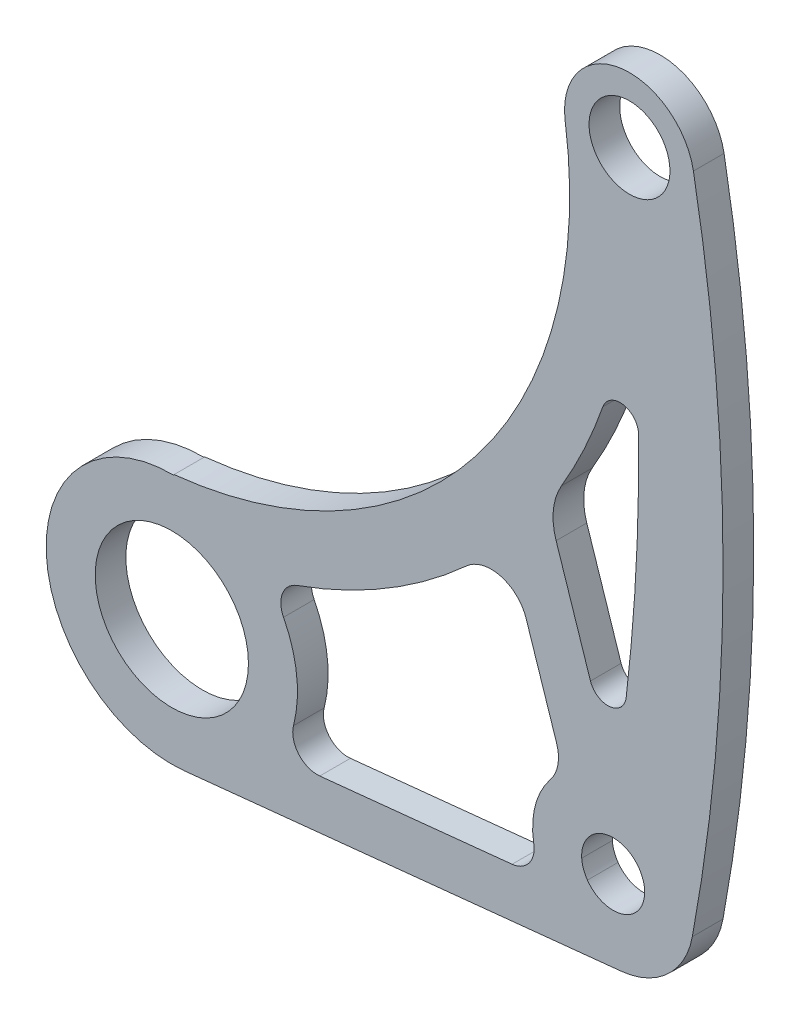
ISO-10303-21;
HEADER;
FILE_DESCRIPTION(('STEP AP214'),'2;1');
FILE_NAME('part.step','',(''),(''),'','','');
FILE_SCHEMA(('AUTOMOTIVE_DESIGN { 1 0 10303 214 1 1 1 1 }'));
ENDSEC;
DATA;
#1=APPLICATION_CONTEXT('core data for automotive mechanical design processes');
#2=APPLICATION_PROTOCOL_DEFINITION('international standard','automotive_design',2000,#1);
#3=PRODUCT_CONTEXT('',#1,'mechanical');
#4=PRODUCT('Part','Part','',(#3));
#5=PRODUCT_RELATED_PRODUCT_CATEGORY('part','',(#4));
#6=PRODUCT_DEFINITION_FORMATION('','',#4);
#7=PRODUCT_DEFINITION_CONTEXT('part definition',#1,'design');
#8=PRODUCT_DEFINITION('design','',#6,#7);
#9=PRODUCT_DEFINITION_SHAPE('','',#8);
#10=(LENGTH_UNIT() NAMED_UNIT(*) SI_UNIT(.MILLI.,.METRE.));
#11=(NAMED_UNIT(*) PLANE_ANGLE_UNIT() SI_UNIT($,.RADIAN.));
#12=(NAMED_UNIT(*) SI_UNIT($,.STERADIAN.) SOLID_ANGLE_UNIT());
#13=UNCERTAINTY_MEASURE_WITH_UNIT(LENGTH_MEASURE(1.E-05),#10,'distance_accuracy_value','');
#14=(GEOMETRIC_REPRESENTATION_CONTEXT(3) GLOBAL_UNCERTAINTY_ASSIGNED_CONTEXT((#13)) GLOBAL_UNIT_ASSIGNED_CONTEXT((#10,
#11,#12)) REPRESENTATION_CONTEXT('',''));
#15=CARTESIAN_POINT('',(0.,0.,0.));
#16=DIRECTION('',(0.,0.,1.));
#17=DIRECTION('',(1.,0.,0.));
#18=AXIS2_PLACEMENT_3D('',#15,#16,#17);
#19=CARTESIAN_POINT('',(45.72,0.,3.175));
#20=DIRECTION('',(0.,0.,-1.));
#21=DIRECTION('',(-1.,0.,0.));
#22=AXIS2_PLACEMENT_3D('',#19,#20,#21);
#23=CYLINDRICAL_SURFACE('',#22,3.2639);
#24=CARTESIAN_POINT('',(45.72,0.,0.));
#25=DIRECTION('',(0.,0.,1.));
#26=DIRECTION('',(1.,0.,0.));
#27=AXIS2_PLACEMENT_3D('',#24,#25,#26);
#28=CIRCLE('',#27,3.2639);
#29=CARTESIAN_POINT('',(42.4625763798194,-0.205510507492002,0.));
#30=VERTEX_POINT('',#29);
#31=CARTESIAN_POINT('',(43.0519360241002,-1.88002069948861,0.));
#32=VERTEX_POINT('',#31);
#33=EDGE_CURVE('E489',#30,#32,#28,.T.);
#34=ORIENTED_EDGE('',*,*,#33,.F.);
#35=DIRECTION('',(0.,0.,1.));
#36=VECTOR('',#35,1.);
#37=CARTESIAN_POINT('',(42.4625763798194,-0.205510507492002,3.175));
#38=LINE('',#37,#36);
#39=CARTESIAN_POINT('',(42.4625763798194,-0.205510507492002,3.175));
#40=VERTEX_POINT('',#39);
#41=EDGE_CURVE('E276',#30,#40,#38,.T.);
#42=ORIENTED_EDGE('',*,*,#41,.T.);
#43=CARTESIAN_POINT('',(45.72,0.,3.175));
#44=DIRECTION('',(0.,0.,1.));
#45=DIRECTION('',(1.,0.,0.));
#46=AXIS2_PLACEMENT_3D('',#43,#44,#45);
#47=CIRCLE('',#46,3.2639);
#48=CARTESIAN_POINT('',(43.0519360241002,-1.88002069948861,3.175));
#49=VERTEX_POINT('',#48);
#50=EDGE_CURVE('E522',#40,#49,#47,.T.);
#51=ORIENTED_EDGE('',*,*,#50,.T.);
#52=DIRECTION('',(0.,0.,1.));
#53=VECTOR('',#52,1.);
#54=CARTESIAN_POINT('',(43.0519360241002,-1.88002069948861,3.175));
#55=LINE('',#54,#53);
#56=EDGE_CURVE('E259',#32,#49,#55,.T.);
#57=ORIENTED_EDGE('',*,*,#56,.F.);
#58=EDGE_LOOP('',(#34,#42,#51,#57));
#59=FACE_BOUND('',#58,.T.);
#60=ADVANCED_FACE('F53',(#59),#23,.F.);
#61=CARTESIAN_POINT('',(48.9774236201806,0.205510507492002,3.175));
#62=VERTEX_POINT('',#61);
#63=EDGE_CURVE('E514',#49,#62,#47,.T.);
#64=ORIENTED_EDGE('',*,*,#63,.T.);
#65=DIRECTION('',(0.,0.,-1.));
#66=VECTOR('',#65,1.);
#67=CARTESIAN_POINT('',(48.9774236201806,0.205510507492002,3.175));
#68=LINE('',#67,#66);
#69=CARTESIAN_POINT('',(48.9774236201806,0.205510507492002,0.));
#70=VERTEX_POINT('',#69);
#71=EDGE_CURVE('E273',#62,#70,#68,.T.);
#72=ORIENTED_EDGE('',*,*,#71,.T.);
#73=EDGE_CURVE('E490',#32,#70,#28,.T.);
#74=ORIENTED_EDGE('',*,*,#73,.F.);
#75=ORIENTED_EDGE('',*,*,#56,.T.);
#76=EDGE_LOOP('',(#64,#72,#74,#75));
#77=FACE_BOUND('',#76,.T.);
#78=ADVANCED_FACE('F599',(#77),#23,.F.);
#79=ORIENTED_EDGE('',*,*,#71,.F.);
#80=CARTESIAN_POINT('',(48.3880639758998,1.88002069948861,3.175));
#81=VERTEX_POINT('',#80);
#82=EDGE_CURVE('E520',#62,#81,#47,.T.);
#83=ORIENTED_EDGE('',*,*,#82,.T.);
#84=DIRECTION('',(0.,0.,-1.));
#85=VECTOR('',#84,1.);
#86=CARTESIAN_POINT('',(48.3880639758998,1.88002069948861,3.175));
#87=LINE('',#86,#85);
#88=CARTESIAN_POINT('',(48.3880639758998,1.88002069948861,0.));
#89=VERTEX_POINT('',#88);
#90=EDGE_CURVE('E264',#81,#89,#87,.T.);
#91=ORIENTED_EDGE('',*,*,#90,.T.);
#92=EDGE_CURVE('E493',#70,#89,#28,.T.);
#93=ORIENTED_EDGE('',*,*,#92,.F.);
#94=EDGE_LOOP('',(#79,#83,#91,#93));
#95=FACE_BOUND('',#94,.T.);
#96=ADVANCED_FACE('F589',(#95),#23,.F.);
#97=CARTESIAN_POINT('',(-142.138533342949,38.656045003802,3.175));
#98=DIRECTION('',(0.,0.,-1.));
#99=DIRECTION('',(-1.,0.,0.));
#100=AXIS2_PLACEMENT_3D('',#97,#98,#99);
#101=CYLINDRICAL_SURFACE('',#100,190.5);
#102=CARTESIAN_POINT('',(-142.138533342949,38.656045003802,0.));
#103=DIRECTION('',(0.,0.,1.));
#104=DIRECTION('',(1.,0.,0.));
#105=AXIS2_PLACEMENT_3D('',#102,#103,#104);
#106=CIRCLE('',#105,190.5);
#107=CARTESIAN_POINT('',(47.0702030784157,16.5132343910918,0.));
#108=VERTEX_POINT('',#107);
#109=CARTESIAN_POINT('',(48.3497321227549,40.7704526909221,0.));
#110=VERTEX_POINT('',#109);
#111=EDGE_CURVE('E413',#108,#110,#106,.T.);
#112=ORIENTED_EDGE('',*,*,#111,.F.);
#113=DIRECTION('',(0.,0.,-1.));
#114=VECTOR('',#113,1.);
#115=CARTESIAN_POINT('',(47.0702030784158,16.5132343910918,3.175));
#116=LINE('',#115,#114);
#117=CARTESIAN_POINT('',(47.0702030784157,16.5132343910918,3.175));
#118=VERTEX_POINT('',#117);
#119=EDGE_CURVE('E354',#108,#118,#116,.F.);
#120=ORIENTED_EDGE('',*,*,#119,.T.);
#121=CARTESIAN_POINT('',(-142.138533342949,38.656045003802,3.175));
#122=DIRECTION('',(0.,0.,1.));
#123=DIRECTION('',(1.,0.,0.));
#124=AXIS2_PLACEMENT_3D('',#121,#122,#123);
#125=CIRCLE('',#124,190.5);
#126=CARTESIAN_POINT('',(48.3497321227549,40.7704526909221,3.175));
#127=VERTEX_POINT('',#126);
#128=EDGE_CURVE('E511',#118,#127,#125,.T.);
#129=ORIENTED_EDGE('',*,*,#128,.T.);
#130=DIRECTION('',(0.,0.,-1.));
#131=VECTOR('',#130,1.);
#132=CARTESIAN_POINT('',(48.3497321227549,40.7704526909221,3.175));
#133=LINE('',#132,#131);
#134=EDGE_CURVE('E350',#127,#110,#133,.T.);
#135=ORIENTED_EDGE('',*,*,#134,.T.);
#136=EDGE_LOOP('',(#112,#120,#129,#135));
#137=FACE_BOUND('',#136,.T.);
#138=ADVANCED_FACE('F500',(#137),#101,.F.);
#139=CARTESIAN_POINT('',(43.9242602583384,14.4500573911322,3.175));
#140=DIRECTION('',(0.949917524329056,0.312500715155273,0.));
#141=DIRECTION('',(-0.312500715155273,0.949917524329056,0.));
#142=AXIS2_PLACEMENT_3D('',#139,#140,#141);
#143=PLANE('',#142);
#144=DIRECTION('',(0.312500715155273,-0.949917524329056,0.));
#145=VECTOR('',#144,1.);
#146=CARTESIAN_POINT('',(43.9242602583384,14.4500573911322,0.));
#147=LINE('',#146,#145);
#148=CARTESIAN_POINT('',(39.8116959434713,26.9511389028385,0.));
#149=VERTEX_POINT('',#148);
#150=CARTESIAN_POINT('',(43.3685228303553,16.1393486348481,0.));
#151=VERTEX_POINT('',#150);
#152=EDGE_CURVE('E407',#149,#151,#147,.T.);
#153=ORIENTED_EDGE('',*,*,#152,.F.);
#154=DIRECTION('',(0.,0.,-1.));
#155=VECTOR('',#154,1.);
#156=CARTESIAN_POINT('',(39.8116959434713,26.9511389028385,3.175));
#157=LINE('',#156,#155);
#158=CARTESIAN_POINT('',(39.8116959434713,26.9511389028385,3.175));
#159=VERTEX_POINT('',#158);
#160=EDGE_CURVE('E75',#149,#159,#157,.F.);
#161=ORIENTED_EDGE('',*,*,#160,.T.);
#162=DIRECTION('',(0.312500715155273,-0.949917524329056,0.));
#163=VECTOR('',#162,1.);
#164=CARTESIAN_POINT('',(43.9242602583384,14.4500573911322,3.175));
#165=LINE('',#164,#163);
#166=CARTESIAN_POINT('',(43.3685228303553,16.1393486348481,3.175));
#167=VERTEX_POINT('',#166);
#168=EDGE_CURVE('E510',#159,#167,#165,.T.);
#169=ORIENTED_EDGE('',*,*,#168,.T.);
#170=DIRECTION('',(0.,0.,1.));
#171=VECTOR('',#170,1.);
#172=CARTESIAN_POINT('',(43.3685228303553,16.1393486348481,0.));
#173=LINE('',#172,#171);
#174=EDGE_CURVE('E346',#167,#151,#173,.F.);
#175=ORIENTED_EDGE('',*,*,#174,.T.);
#176=EDGE_LOOP('',(#153,#161,#169,#175));
#177=FACE_BOUND('',#176,.T.);
#178=ADVANCED_FACE('F637',(#177),#143,.T.);
#179=CARTESIAN_POINT('',(0.811388888888889,-7.89592010604133,3.175));
#180=DIRECTION('',(-0.102222222222222,0.994761588162687,0.));
#181=DIRECTION('',(-0.994761588162687,-0.102222222222222,0.));
#182=AXIS2_PLACEMENT_3D('',#179,#180,#181);
#183=PLANE('',#182);
#184=DIRECTION('',(0.994761588162687,0.102222222222222,0.));
#185=VECTOR('',#184,1.);
#186=CARTESIAN_POINT('',(0.811388888888889,-7.89592010604133,0.));
#187=LINE('',#186,#185);
#188=CARTESIAN_POINT('',(15.3261433532772,-6.40437632910465,0.));
#189=VERTEX_POINT('',#188);
#190=CARTESIAN_POINT('',(35.2507315842154,-4.35691519865322,0.));
#191=VERTEX_POINT('',#190);
#192=EDGE_CURVE('E470',#189,#191,#187,.T.);
#193=ORIENTED_EDGE('',*,*,#192,.F.);
#194=DIRECTION('',(0.,0.,-1.));
#195=VECTOR('',#194,1.);
#196=CARTESIAN_POINT('',(15.3261433532772,-6.40437632910465,3.175));
#197=LINE('',#196,#195);
#198=CARTESIAN_POINT('',(15.3261433532772,-6.40437632910465,3.175));
#199=VERTEX_POINT('',#198);
#200=EDGE_CURVE('E290',#189,#199,#197,.F.);
#201=ORIENTED_EDGE('',*,*,#200,.T.);
#202=DIRECTION('',(0.994761588162687,0.102222222222222,0.));
#203=VECTOR('',#202,1.);
#204=CARTESIAN_POINT('',(0.811388888888889,-7.89592010604133,3.175));
#205=LINE('',#204,#203);
#206=CARTESIAN_POINT('',(35.2507315842154,-4.35691519865322,3.175));
#207=VERTEX_POINT('',#206);
#208=EDGE_CURVE('E561',#199,#207,#205,.T.);
#209=ORIENTED_EDGE('',*,*,#208,.T.);
#210=DIRECTION('',(0.,0.,-1.));
#211=VECTOR('',#210,1.);
#212=CARTESIAN_POINT('',(35.2507315842154,-4.35691519865322,3.175));
#213=LINE('',#212,#211);
#214=EDGE_CURVE('E286',#207,#191,#213,.T.);
#215=ORIENTED_EDGE('',*,*,#214,.T.);
#216=EDGE_LOOP('',(#193,#201,#209,#215));
#217=FACE_BOUND('',#216,.T.);
#218=ADVANCED_FACE('F643',(#217),#183,.T.);
#219=CARTESIAN_POINT('',(0.,0.,3.175));
#220=DIRECTION('',(0.,0.,-1.));
#221=DIRECTION('',(-1.,0.,0.));
#222=AXIS2_PLACEMENT_3D('',#219,#220,#221);
#223=CYLINDRICAL_SURFACE('',#222,13.0175);
#224=CARTESIAN_POINT('',(0.,0.,3.175));
#225=DIRECTION('',(0.,0.,1.));
#226=DIRECTION('',(1.,0.,0.));
#227=AXIS2_PLACEMENT_3D('',#224,#225,#226);
#228=CIRCLE('',#227,13.0175);
#229=CARTESIAN_POINT('',(12.6066623522887,-3.24459097351078,3.175));
#230=VERTEX_POINT('',#229);
#231=CARTESIAN_POINT('',(11.5722495603721,5.9614047306376,3.175));
#232=VERTEX_POINT('',#231);
#233=EDGE_CURVE('E565',#230,#232,#228,.T.);
#234=ORIENTED_EDGE('',*,*,#233,.F.);
#235=DIRECTION('',(0.,0.,-1.));
#236=VECTOR('',#235,1.);
#237=CARTESIAN_POINT('',(12.6066623522887,-3.24459097351078,3.175));
#238=LINE('',#237,#236);
#239=CARTESIAN_POINT('',(12.6066623522887,-3.24459097351078,0.));
#240=VERTEX_POINT('',#239);
#241=EDGE_CURVE('E282',#230,#240,#238,.T.);
#242=ORIENTED_EDGE('',*,*,#241,.T.);
#243=CARTESIAN_POINT('',(0.,0.,0.));
#244=DIRECTION('',(0.,0.,1.));
#245=DIRECTION('',(1.,0.,0.));
#246=AXIS2_PLACEMENT_3D('',#243,#244,#245);
#247=CIRCLE('',#246,13.0175);
#248=CARTESIAN_POINT('',(11.5722495603721,5.9614047306376,0.));
#249=VERTEX_POINT('',#248);
#250=EDGE_CURVE('E474',#240,#249,#247,.T.);
#251=ORIENTED_EDGE('',*,*,#250,.T.);
#252=DIRECTION('',(0.,0.,-1.));
#253=VECTOR('',#252,1.);
#254=CARTESIAN_POINT('',(11.5722495603721,5.9614047306376,3.175));
#255=LINE('',#254,#253);
#256=EDGE_CURVE('E279',#249,#232,#255,.F.);
#257=ORIENTED_EDGE('',*,*,#256,.T.);
#258=EDGE_LOOP('',(#234,#242,#251,#257));
#259=FACE_BOUND('',#258,.T.);
#260=ADVANCED_FACE('F758',(#259),#223,.T.);
#261=CARTESIAN_POINT('',(-4.50533240745612,58.5644592406378,3.175));
#262=DIRECTION('',(0.,0.,-1.));
#263=DIRECTION('',(-1.,0.,0.));
#264=AXIS2_PLACEMENT_3D('',#261,#262,#263);
#265=CYLINDRICAL_SURFACE('',#264,52.07);
#266=CARTESIAN_POINT('',(-4.50533240745612,58.5644592406378,0.));
#267=DIRECTION('',(0.,0.,1.));
#268=DIRECTION('',(1.,0.,0.));
#269=AXIS2_PLACEMENT_3D('',#266,#267,#268);
#270=CIRCLE('',#269,52.07);
#271=CARTESIAN_POINT('',(12.9774317126353,9.51715698331437,0.));
#272=VERTEX_POINT('',#271);
#273=CARTESIAN_POINT('',(30.5233562094004,20.0381581752188,0.));
#274=VERTEX_POINT('',#273);
#275=EDGE_CURVE('E478',#272,#274,#270,.T.);
#276=ORIENTED_EDGE('',*,*,#275,.T.);
#277=DIRECTION('',(0.,0.,-1.));
#278=VECTOR('',#277,1.);
#279=CARTESIAN_POINT('',(30.5233562094004,20.0381581752188,3.175));
#280=LINE('',#279,#278);
#281=CARTESIAN_POINT('',(30.5233562094004,20.0381581752188,3.175));
#282=VERTEX_POINT('',#281);
#283=EDGE_CURVE('E331',#274,#282,#280,.F.);
#284=ORIENTED_EDGE('',*,*,#283,.T.);
#285=CARTESIAN_POINT('',(-4.50533240745612,58.5644592406378,3.175));
#286=DIRECTION('',(0.,0.,1.));
#287=DIRECTION('',(1.,0.,0.));
#288=AXIS2_PLACEMENT_3D('',#285,#286,#287);
#289=CIRCLE('',#288,52.07);
#290=CARTESIAN_POINT('',(12.9774317126353,9.51715698331437,3.175));
#291=VERTEX_POINT('',#290);
#292=EDGE_CURVE('E569',#291,#282,#289,.T.);
#293=ORIENTED_EDGE('',*,*,#292,.F.);
#294=DIRECTION('',(0.,0.,-1.));
#295=VECTOR('',#294,1.);
#296=CARTESIAN_POINT('',(12.9774317126353,9.51715698331437,3.175));
#297=LINE('',#296,#295);
#298=EDGE_CURVE('E297',#291,#272,#297,.T.);
#299=ORIENTED_EDGE('',*,*,#298,.T.);
#300=EDGE_LOOP('',(#276,#284,#293,#299));
#301=FACE_BOUND('',#300,.T.);
#302=ADVANCED_FACE('F766',(#301),#265,.T.);
#303=CARTESIAN_POINT('',(38.586011370491,12.6938979852854,3.175));
#304=DIRECTION('',(0.949917524329056,0.312500715155272,0.));
#305=DIRECTION('',(-0.312500715155272,0.949917524329057,0.));
#306=AXIS2_PLACEMENT_3D('',#303,#304,#305);
#307=PLANE('',#306);
#308=DIRECTION('',(0.312500715155272,-0.949917524329057,0.));
#309=VECTOR('',#308,1.);
#310=CARTESIAN_POINT('',(38.586011370491,12.6938979852854,0.));
#311=LINE('',#310,#309);
#312=CARTESIAN_POINT('',(36.7056167539373,18.4097882610273,0.));
#313=VERTEX_POINT('',#312);
#314=CARTESIAN_POINT('',(39.8655919363517,8.80431967600672,0.));
#315=VERTEX_POINT('',#314);
#316=EDGE_CURVE('E482',#313,#315,#311,.T.);
#317=ORIENTED_EDGE('',*,*,#316,.T.);
#318=DIRECTION('',(0.,0.,1.));
#319=VECTOR('',#318,1.);
#320=CARTESIAN_POINT('',(39.8655919363517,8.80431967600672,3.175));
#321=LINE('',#320,#319);
#322=CARTESIAN_POINT('',(39.8655919363517,8.80431967600672,3.175));
#323=VERTEX_POINT('',#322);
#324=EDGE_CURVE('E328',#315,#323,#321,.T.);
#325=ORIENTED_EDGE('',*,*,#324,.T.);
#326=DIRECTION('',(0.312500715155272,-0.949917524329057,0.));
#327=VECTOR('',#326,1.);
#328=CARTESIAN_POINT('',(38.586011370491,12.6938979852854,3.175));
#329=LINE('',#328,#327);
#330=CARTESIAN_POINT('',(36.7056167539373,18.4097882610273,3.175));
#331=VERTEX_POINT('',#330);
#332=EDGE_CURVE('E573',#331,#323,#329,.T.);
#333=ORIENTED_EDGE('',*,*,#332,.F.);
#334=DIRECTION('',(0.,0.,1.));
#335=VECTOR('',#334,1.);
#336=CARTESIAN_POINT('',(36.7056167539373,18.4097882610273,0.));
#337=LINE('',#336,#335);
#338=EDGE_CURVE('E324',#331,#313,#337,.F.);
#339=ORIENTED_EDGE('',*,*,#338,.T.);
#340=EDGE_LOOP('',(#317,#325,#333,#339));
#341=FACE_BOUND('',#340,.T.);
#342=ADVANCED_FACE('F675',(#341),#307,.F.);
#343=CARTESIAN_POINT('',(45.72,0.,3.175));
#344=DIRECTION('',(0.,0.,-1.));
#345=DIRECTION('',(-1.,0.,0.));
#346=AXIS2_PLACEMENT_3D('',#343,#344,#345);
#347=CYLINDRICAL_SURFACE('',#346,8.3439);
#348=CARTESIAN_POINT('',(45.72,0.,0.));
#349=DIRECTION('',(0.,0.,1.));
#350=DIRECTION('',(1.,0.,0.));
#351=AXIS2_PLACEMENT_3D('',#348,#349,#350);
#352=CIRCLE('',#351,8.3439);
#353=CARTESIAN_POINT('',(46.572932,-8.30019121547064,0.));
#354=VERTEX_POINT('',#353);
#355=CARTESIAN_POINT('',(53.9245222927567,-1.51871036002841,0.));
#356=VERTEX_POINT('',#355);
#357=EDGE_CURVE('E257',#354,#356,#352,.T.);
#358=ORIENTED_EDGE('',*,*,#357,.T.);
#359=DIRECTION('',(0.,0.,-1.));
#360=VECTOR('',#359,1.);
#361=CARTESIAN_POINT('',(53.9245222927567,-1.51871036002841,3.175));
#362=LINE('',#361,#360);
#363=CARTESIAN_POINT('',(53.9245222927567,-1.51871036002841,3.175));
#364=VERTEX_POINT('',#363);
#365=EDGE_CURVE('E235',#364,#356,#362,.T.);
#366=ORIENTED_EDGE('',*,*,#365,.F.);
#367=CARTESIAN_POINT('',(45.72,0.,3.175));
#368=DIRECTION('',(0.,0.,1.));
#369=DIRECTION('',(1.,0.,0.));
#370=AXIS2_PLACEMENT_3D('',#367,#368,#369);
#371=CIRCLE('',#370,8.3439);
#372=CARTESIAN_POINT('',(46.572932,-8.30019121547064,3.175));
#373=VERTEX_POINT('',#372);
#374=EDGE_CURVE('E243',#373,#364,#371,.T.);
#375=ORIENTED_EDGE('',*,*,#374,.F.);
#376=DIRECTION('',(0.,0.,-1.));
#377=VECTOR('',#376,1.);
#378=CARTESIAN_POINT('',(46.572932,-8.30019121547064,3.175));
#379=LINE('',#378,#377);
#380=EDGE_CURVE('E420',#373,#354,#379,.T.);
#381=ORIENTED_EDGE('',*,*,#380,.T.);
#382=EDGE_LOOP('',(#358,#366,#375,#381));
#383=FACE_BOUND('',#382,.T.);
#384=ADVANCED_FACE('F255',(#383),#347,.T.);
#385=CARTESIAN_POINT('',(-133.393338272466,33.1550421520357,3.175));
#386=DIRECTION('',(0.,0.,-1.));
#387=DIRECTION('',(-1.,0.,0.));
#388=AXIS2_PLACEMENT_3D('',#385,#386,#387);
#389=CYLINDRICAL_SURFACE('',#388,190.5);
#390=CARTESIAN_POINT('',(-133.393338272466,33.1550421520357,0.));
#391=DIRECTION('',(0.,0.,1.));
#392=DIRECTION('',(1.,0.,0.));
#393=AXIS2_PLACEMENT_3D('',#390,#391,#392);
#394=CIRCLE('',#393,190.5);
#395=CARTESIAN_POINT('',(54.0358306347205,67.2219857008992,0.));
#396=VERTEX_POINT('',#395);
#397=EDGE_CURVE('E450',#356,#396,#394,.T.);
#398=ORIENTED_EDGE('',*,*,#397,.T.);
#399=DIRECTION('',(0.,0.,-1.));
#400=VECTOR('',#399,1.);
#401=CARTESIAN_POINT('',(54.0358306347205,67.2219857008992,3.175));
#402=LINE('',#401,#400);
#403=CARTESIAN_POINT('',(54.0358306347205,67.2219857008992,3.175));
#404=VERTEX_POINT('',#403);
#405=EDGE_CURVE('E238',#404,#396,#402,.T.);
#406=ORIENTED_EDGE('',*,*,#405,.F.);
#407=CARTESIAN_POINT('',(-133.393338272466,33.1550421520357,3.175));
#408=DIRECTION('',(0.,0.,1.));
#409=DIRECTION('',(1.,0.,0.));
#410=AXIS2_PLACEMENT_3D('',#407,#408,#409);
#411=CIRCLE('',#410,190.5);
#412=EDGE_CURVE('E231',#364,#404,#411,.T.);
#413=ORIENTED_EDGE('',*,*,#412,.F.);
#414=ORIENTED_EDGE('',*,*,#365,.T.);
#415=EDGE_LOOP('',(#398,#406,#413,#414));
#416=FACE_BOUND('',#415,.T.);
#417=ADVANCED_FACE('F233',(#416),#389,.T.);
#418=CARTESIAN_POINT('',(47.4133333333333,66.0182870288394,3.175));
#419=DIRECTION('',(0.,0.,-1.));
#420=DIRECTION('',(-1.,0.,0.));
#421=AXIS2_PLACEMENT_3D('',#418,#419,#420);
#422=CYLINDRICAL_SURFACE('',#421,6.73099999999993);
#423=CARTESIAN_POINT('',(47.4133333333333,66.0182870288394,0.));
#424=DIRECTION('',(0.,0.,1.));
#425=DIRECTION('',(1.,0.,0.));
#426=AXIS2_PLACEMENT_3D('',#423,#424,#425);
#427=CIRCLE('',#426,6.73099999999993);
#428=CARTESIAN_POINT('',(40.7506474150239,65.0617425427021,0.));
#429=VERTEX_POINT('',#428);
#430=EDGE_CURVE('E446',#396,#429,#427,.T.);
#431=ORIENTED_EDGE('',*,*,#430,.T.);
#432=DIRECTION('',(0.,0.,-1.));
#433=VECTOR('',#432,1.);
#434=CARTESIAN_POINT('',(40.7506474150239,65.0617425427021,3.175));
#435=LINE('',#434,#433);
#436=CARTESIAN_POINT('',(40.7506474150239,65.0617425427021,3.175));
#437=VERTEX_POINT('',#436);
#438=EDGE_CURVE('E266',#437,#429,#435,.T.);
#439=ORIENTED_EDGE('',*,*,#438,.F.);
#440=CARTESIAN_POINT('',(47.4133333333333,66.0182870288394,3.175));
#441=DIRECTION('',(0.,0.,1.));
#442=DIRECTION('',(1.,0.,0.));
#443=AXIS2_PLACEMENT_3D('',#440,#441,#442);
#444=CIRCLE('',#443,6.73099999999993);
#445=EDGE_CURVE('E242',#404,#437,#444,.T.);
#446=ORIENTED_EDGE('',*,*,#445,.F.);
#447=ORIENTED_EDGE('',*,*,#405,.T.);
#448=EDGE_LOOP('',(#431,#439,#446,#447));
#449=FACE_BOUND('',#448,.T.);
#450=ADVANCED_FACE('F447',(#449),#422,.T.);
#451=CARTESIAN_POINT('',(-4.50533240745612,58.5644592406378,3.175));
#452=DIRECTION('',(0.,0.,-1.));
#453=DIRECTION('',(-1.,0.,0.));
#454=AXIS2_PLACEMENT_3D('',#451,#452,#453);
#455=CYLINDRICAL_SURFACE('',#454,45.72);
#456=CARTESIAN_POINT('',(-4.50533240745612,58.5644592406378,0.));
#457=DIRECTION('',(0.,0.,1.));
#458=DIRECTION('',(1.,0.,0.));
#459=AXIS2_PLACEMENT_3D('',#456,#457,#458);
#460=CIRCLE('',#459,45.72);
#461=CARTESIAN_POINT('',(0.230104831543752,13.0903563450831,0.));
#462=VERTEX_POINT('',#461);
#463=EDGE_CURVE('E440',#462,#429,#460,.T.);
#464=ORIENTED_EDGE('',*,*,#463,.F.);
#465=DIRECTION('',(0.,0.,-1.));
#466=VECTOR('',#465,1.);
#467=CARTESIAN_POINT('',(0.230104831543752,13.0903563450831,3.175));
#468=LINE('',#467,#466);
#469=CARTESIAN_POINT('',(0.230104831543752,13.0903563450831,3.175));
#470=VERTEX_POINT('',#469);
#471=EDGE_CURVE('E430',#470,#462,#468,.T.);
#472=ORIENTED_EDGE('',*,*,#471,.F.);
#473=CARTESIAN_POINT('',(-4.50533240745612,58.5644592406378,3.175));
#474=DIRECTION('',(0.,0.,1.));
#475=DIRECTION('',(1.,0.,0.));
#476=AXIS2_PLACEMENT_3D('',#473,#474,#475);
#477=CIRCLE('',#476,45.72);
#478=EDGE_CURVE('E443',#470,#437,#477,.T.);
#479=ORIENTED_EDGE('',*,*,#478,.T.);
#480=ORIENTED_EDGE('',*,*,#438,.T.);
#481=EDGE_LOOP('',(#464,#472,#479,#480));
#482=FACE_BOUND('',#481,.T.);
#483=ADVANCED_FACE('F438',(#482),#455,.F.);
#484=CARTESIAN_POINT('',(-6.2268221741051,4.92245790861365,3.175));
#485=DIRECTION('',(-0.784481533745524,0.620152177463137,0.));
#486=DIRECTION('',(-0.620152177463137,-0.784481533745524,0.));
#487=AXIS2_PLACEMENT_3D('',#484,#485,#486);
#488=PLANE('',#487);
#489=DIRECTION('',(0.620152177463137,0.784481533745524,0.));
#490=VECTOR('',#489,1.);
#491=CARTESIAN_POINT('',(-6.2268221741051,4.92245790861365,0.));
#492=LINE('',#491,#490);
#493=CARTESIAN_POINT('',(0.171615761059916,13.0163687056166,0.));
#494=VERTEX_POINT('',#493);
#495=EDGE_CURVE('E455',#494,#462,#492,.T.);
#496=ORIENTED_EDGE('',*,*,#495,.F.);
#497=DIRECTION('',(0.,0.,-1.));
#498=VECTOR('',#497,1.);
#499=CARTESIAN_POINT('',(0.171615761059916,13.0163687056166,3.175));
#500=LINE('',#499,#498);
#501=CARTESIAN_POINT('',(0.171615761059916,13.0163687056166,3.175));
#502=VERTEX_POINT('',#501);
#503=EDGE_CURVE('E427',#502,#494,#500,.T.);
#504=ORIENTED_EDGE('',*,*,#503,.F.);
#505=DIRECTION('',(0.620152177463137,0.784481533745524,0.));
#506=VECTOR('',#505,1.);
#507=CARTESIAN_POINT('',(-6.2268221741051,4.92245790861365,3.175));
#508=LINE('',#507,#506);
#509=EDGE_CURVE('E548',#502,#470,#508,.T.);
#510=ORIENTED_EDGE('',*,*,#509,.T.);
#511=ORIENTED_EDGE('',*,*,#471,.T.);
#512=EDGE_LOOP('',(#496,#504,#510,#511));
#513=FACE_BOUND('',#512,.T.);
#514=ADVANCED_FACE('F545',(#513),#488,.T.);
#515=CARTESIAN_POINT('',(0.,0.,3.175));
#516=DIRECTION('',(0.,0.,-1.));
#517=DIRECTION('',(-1.,0.,0.));
#518=AXIS2_PLACEMENT_3D('',#515,#516,#517);
#519=CYLINDRICAL_SURFACE('',#518,13.0175);
#520=CARTESIAN_POINT('',(0.,0.,0.));
#521=DIRECTION('',(0.,0.,1.));
#522=DIRECTION('',(1.,0.,0.));
#523=AXIS2_PLACEMENT_3D('',#520,#521,#522);
#524=CIRCLE('',#523,13.0175);
#525=CARTESIAN_POINT('',(1.33067777777778,-12.9493089739078,0.));
#526=VERTEX_POINT('',#525);
#527=EDGE_CURVE('E459',#494,#526,#524,.T.);
#528=ORIENTED_EDGE('',*,*,#527,.T.);
#529=DIRECTION('',(0.,0.,-1.));
#530=VECTOR('',#529,1.);
#531=CARTESIAN_POINT('',(1.33067777777778,-12.9493089739078,3.175));
#532=LINE('',#531,#530);
#533=CARTESIAN_POINT('',(1.33067777777778,-12.9493089739078,3.175));
#534=VERTEX_POINT('',#533);
#535=EDGE_CURVE('E423',#534,#526,#532,.T.);
#536=ORIENTED_EDGE('',*,*,#535,.F.);
#537=CARTESIAN_POINT('',(0.,0.,3.175));
#538=DIRECTION('',(0.,0.,1.));
#539=DIRECTION('',(1.,0.,0.));
#540=AXIS2_PLACEMENT_3D('',#537,#538,#539);
#541=CIRCLE('',#540,13.0175);
#542=EDGE_CURVE('E553',#502,#534,#541,.T.);
#543=ORIENTED_EDGE('',*,*,#542,.F.);
#544=ORIENTED_EDGE('',*,*,#503,.T.);
#545=EDGE_LOOP('',(#528,#536,#543,#544));
#546=FACE_BOUND('',#545,.T.);
#547=ADVANCED_FACE('F543',(#546),#519,.T.);
#548=CARTESIAN_POINT('',(47.4133333333333,66.0182870288394,3.175));
#549=DIRECTION('',(0.,0.,-1.));
#550=DIRECTION('',(-1.,0.,0.));
#551=AXIS2_PLACEMENT_3D('',#548,#549,#550);
#552=CYLINDRICAL_SURFACE('',#551,4.1910000000001);
#553=CARTESIAN_POINT('',(47.4133333333333,66.0182870288394,3.175));
#554=DIRECTION('',(0.,0.,1.));
#555=DIRECTION('',(1.,0.,0.));
#556=AXIS2_PLACEMENT_3D('',#553,#554,#555);
#557=CIRCLE('',#556,4.1910000000001);
#558=CARTESIAN_POINT('',(51.6043333333335,66.0182870288394,3.175));
#559=VERTEX_POINT('',#558);
#560=EDGE_CURVE('E528',#559,#559,#557,.T.);
#561=ORIENTED_EDGE('',*,*,#560,.T.);
#562=EDGE_LOOP('',(#561));
#563=FACE_BOUND('',#562,.T.);
#564=CARTESIAN_POINT('',(47.4133333333333,66.0182870288394,0.));
#565=DIRECTION('',(0.,0.,1.));
#566=DIRECTION('',(1.,0.,0.));
#567=AXIS2_PLACEMENT_3D('',#564,#565,#566);
#568=CIRCLE('',#567,4.1910000000001);
#569=CARTESIAN_POINT('',(51.6043333333335,66.0182870288394,0.));
#570=VERTEX_POINT('',#569);
#571=EDGE_CURVE('E406',#570,#570,#568,.T.);
#572=ORIENTED_EDGE('',*,*,#571,.F.);
#573=EDGE_LOOP('',(#572));
#574=FACE_BOUND('',#573,.T.);
#575=ADVANCED_FACE('F633',(#563,#574),#552,.F.);
#576=CARTESIAN_POINT('',(-4.50533240745612,58.5644592406378,3.175));
#577=DIRECTION('',(0.,0.,-1.));
#578=DIRECTION('',(-1.,0.,0.));
#579=AXIS2_PLACEMENT_3D('',#576,#577,#578);
#580=CYLINDRICAL_SURFACE('',#579,52.07);
#581=CARTESIAN_POINT('',(-4.50533240745612,58.5644592406378,3.175));
#582=DIRECTION('',(0.,0.,1.));
#583=DIRECTION('',(1.,0.,0.));
#584=AXIS2_PLACEMENT_3D('',#581,#582,#583);
#585=CIRCLE('',#584,52.07);
#586=CARTESIAN_POINT('',(40.3709543283503,32.1560554871792,3.175));
#587=VERTEX_POINT('',#586);
#588=CARTESIAN_POINT('',(44.646607754843,41.3780786361658,3.175));
#589=VERTEX_POINT('',#588);
#590=EDGE_CURVE('E398',#587,#589,#585,.T.);
#591=ORIENTED_EDGE('',*,*,#590,.F.);
#592=DIRECTION('',(0.,0.,-1.));
#593=VECTOR('',#592,1.);
#594=CARTESIAN_POINT('',(40.3709543283503,32.1560554871792,3.175));
#595=LINE('',#594,#593);
#596=CARTESIAN_POINT('',(40.3709543283503,32.1560554871792,0.));
#597=VERTEX_POINT('',#596);
#598=EDGE_CURVE('E375',#587,#597,#595,.T.);
#599=ORIENTED_EDGE('',*,*,#598,.T.);
#600=CARTESIAN_POINT('',(-4.50533240745612,58.5644592406378,0.));
#601=DIRECTION('',(0.,0.,1.));
#602=DIRECTION('',(1.,0.,0.));
#603=AXIS2_PLACEMENT_3D('',#600,#601,#602);
#604=CIRCLE('',#603,52.07);
#605=CARTESIAN_POINT('',(44.646607754843,41.3780786361658,0.));
#606=VERTEX_POINT('',#605);
#607=EDGE_CURVE('E397',#597,#606,#604,.T.);
#608=ORIENTED_EDGE('',*,*,#607,.T.);
#609=DIRECTION('',(0.,0.,-1.));
#610=VECTOR('',#609,1.);
#611=CARTESIAN_POINT('',(44.646607754843,41.3780786361658,3.175));
#612=LINE('',#611,#610);
#613=EDGE_CURVE('E357',#606,#589,#612,.F.);
#614=ORIENTED_EDGE('',*,*,#613,.T.);
#615=EDGE_LOOP('',(#591,#599,#608,#614));
#616=FACE_BOUND('',#615,.T.);
#617=ADVANCED_FACE('F396',(#616),#580,.T.);
#618=ORIENTED_EDGE('',*,*,#41,.F.);
#619=EDGE_CURVE('E494',#89,#30,#28,.T.);
#620=ORIENTED_EDGE('',*,*,#619,.F.);
#621=ORIENTED_EDGE('',*,*,#90,.F.);
#622=EDGE_CURVE('E523',#81,#40,#47,.T.);
#623=ORIENTED_EDGE('',*,*,#622,.T.);
#624=EDGE_LOOP('',(#618,#620,#621,#623));
#625=FACE_BOUND('',#624,.T.);
#626=ADVANCED_FACE('F596',(#625),#23,.F.);
#627=CARTESIAN_POINT('',(45.72,0.,3.175));
#628=DIRECTION('',(0.,0.,-1.));
#629=DIRECTION('',(-1.,0.,0.));
#630=AXIS2_PLACEMENT_3D('',#627,#628,#629);
#631=CYLINDRICAL_SURFACE('',#630,8.3439);
#632=CARTESIAN_POINT('',(45.72,0.,3.175));
#633=DIRECTION('',(0.,0.,1.));
#634=DIRECTION('',(1.,0.,0.));
#635=AXIS2_PLACEMENT_3D('',#632,#633,#634);
#636=CIRCLE('',#635,8.3439);
#637=CARTESIAN_POINT('',(39.2161847991728,5.22695466246729,3.175));
#638=VERTEX_POINT('',#637);
#639=CARTESIAN_POINT('',(37.494917445542,-1.40309806583551,3.175));
#640=VERTEX_POINT('',#639);
#641=EDGE_CURVE('E576',#638,#640,#636,.T.);
#642=ORIENTED_EDGE('',*,*,#641,.F.);
#643=DIRECTION('',(0.,0.,-1.));
#644=VECTOR('',#643,1.);
#645=CARTESIAN_POINT('',(39.2161847991728,5.22695466246729,3.175));
#646=LINE('',#645,#644);
#647=CARTESIAN_POINT('',(39.2161847991728,5.22695466246729,0.));
#648=VERTEX_POINT('',#647);
#649=EDGE_CURVE('E320',#638,#648,#646,.T.);
#650=ORIENTED_EDGE('',*,*,#649,.T.);
#651=CARTESIAN_POINT('',(45.72,0.,0.));
#652=DIRECTION('',(0.,0.,1.));
#653=DIRECTION('',(1.,0.,0.));
#654=AXIS2_PLACEMENT_3D('',#651,#652,#653);
#655=CIRCLE('',#654,8.3439);
#656=CARTESIAN_POINT('',(37.494917445542,-1.40309806583551,0.));
#657=VERTEX_POINT('',#656);
#658=EDGE_CURVE('E486',#648,#657,#655,.T.);
#659=ORIENTED_EDGE('',*,*,#658,.T.);
#660=DIRECTION('',(0.,0.,-1.));
#661=VECTOR('',#660,1.);
#662=CARTESIAN_POINT('',(37.494917445542,-1.40309806583552,3.175));
#663=LINE('',#662,#661);
#664=EDGE_CURVE('E293',#657,#640,#663,.F.);
#665=ORIENTED_EDGE('',*,*,#664,.T.);
#666=EDGE_LOOP('',(#642,#650,#659,#665));
#667=FACE_BOUND('',#666,.T.);
#668=ADVANCED_FACE('F628',(#667),#631,.T.);
#669=CARTESIAN_POINT('',(1.33067777777778,-12.9493089739078,3.175));
#670=DIRECTION('',(0.102222222222222,-0.994761588162687,0.));
#671=DIRECTION('',(0.994761588162687,0.102222222222222,0.));
#672=AXIS2_PLACEMENT_3D('',#669,#670,#671);
#673=PLANE('',#672);
#674=DIRECTION('',(-0.994761588162687,-0.102222222222222,0.));
#675=VECTOR('',#674,1.);
#676=CARTESIAN_POINT('',(1.33067777777778,-12.9493089739078,0.));
#677=LINE('',#676,#675);
#678=EDGE_CURVE('E466',#354,#526,#677,.T.);
#679=ORIENTED_EDGE('',*,*,#678,.F.);
#680=ORIENTED_EDGE('',*,*,#380,.F.);
#681=DIRECTION('',(-0.994761588162687,-0.102222222222222,0.));
#682=VECTOR('',#681,1.);
#683=CARTESIAN_POINT('',(1.33067777777778,-12.9493089739078,3.175));
#684=LINE('',#683,#682);
#685=EDGE_CURVE('E250',#373,#534,#684,.T.);
#686=ORIENTED_EDGE('',*,*,#685,.T.);
#687=ORIENTED_EDGE('',*,*,#535,.T.);
#688=EDGE_LOOP('',(#679,#680,#686,#687));
#689=FACE_BOUND('',#688,.T.);
#690=ADVANCED_FACE('F539',(#689),#673,.T.);
#691=CARTESIAN_POINT('',(0.,0.,3.175));
#692=DIRECTION('',(0.,0.,-1.));
#693=DIRECTION('',(-1.,0.,0.));
#694=AXIS2_PLACEMENT_3D('',#691,#692,#693);
#695=CYLINDRICAL_SURFACE('',#694,7.9375);
#696=CARTESIAN_POINT('',(0.,0.,3.175));
#697=DIRECTION('',(0.,0.,1.));
#698=DIRECTION('',(1.,0.,0.));
#699=AXIS2_PLACEMENT_3D('',#696,#697,#698);
#700=CIRCLE('',#699,7.9375);
#701=CARTESIAN_POINT('',(7.9375,0.,3.175));
#702=VERTEX_POINT('',#701);
#703=EDGE_CURVE('E424',#702,#702,#700,.T.);
#704=ORIENTED_EDGE('',*,*,#703,.T.);
#705=EDGE_LOOP('',(#704));
#706=FACE_BOUND('',#705,.T.);
#707=CARTESIAN_POINT('',(0.,0.,0.));
#708=DIRECTION('',(0.,0.,1.));
#709=DIRECTION('',(1.,0.,0.));
#710=AXIS2_PLACEMENT_3D('',#707,#708,#709);
#711=CIRCLE('',#710,7.9375);
#712=CARTESIAN_POINT('',(7.9375,0.,0.));
#713=VERTEX_POINT('',#712);
#714=EDGE_CURVE('E253',#713,#713,#711,.T.);
#715=ORIENTED_EDGE('',*,*,#714,.F.);
#716=EDGE_LOOP('',(#715));
#717=FACE_BOUND('',#716,.T.);
#718=ADVANCED_FACE('F617',(#706,#717),#695,.F.);
#719=CARTESIAN_POINT('',(0.,0.,3.175));
#720=DIRECTION('',(0.,0.,1.));
#721=DIRECTION('',(1.,0.,0.));
#722=AXIS2_PLACEMENT_3D('',#719,#720,#721);
#723=PLANE('',#722);
#724=ORIENTED_EDGE('',*,*,#374,.T.);
#725=ORIENTED_EDGE('',*,*,#412,.T.);
#726=ORIENTED_EDGE('',*,*,#445,.T.);
#727=ORIENTED_EDGE('',*,*,#478,.F.);
#728=ORIENTED_EDGE('',*,*,#509,.F.);
#729=ORIENTED_EDGE('',*,*,#542,.T.);
#730=ORIENTED_EDGE('',*,*,#685,.F.);
#731=EDGE_LOOP('',(#724,#725,#726,#727,#728,#729,#730));
#732=FACE_BOUND('',#731,.T.);
#733=ORIENTED_EDGE('',*,*,#208,.F.);
#734=CARTESIAN_POINT('',(15.0664989088328,-3.87768189517143,3.175));
#735=DIRECTION('',(0.,0.,1.));
#736=DIRECTION('',(1.,0.,0.));
#737=AXIS2_PLACEMENT_3D('',#734,#735,#736);
#738=CIRCLE('',#737,2.54);
#739=EDGE_CURVE('E304',#199,#230,#738,.F.);
#740=ORIENTED_EDGE('',*,*,#739,.T.);
#741=ORIENTED_EDGE('',*,*,#233,.T.);
#742=CARTESIAN_POINT('',(13.830249474591,7.12460565368884,3.175));
#743=DIRECTION('',(0.,0.,1.));
#744=DIRECTION('',(1.,0.,0.));
#745=AXIS2_PLACEMENT_3D('',#742,#743,#744);
#746=CIRCLE('',#745,2.54);
#747=EDGE_CURVE('E317',#232,#291,#746,.F.);
#748=ORIENTED_EDGE('',*,*,#747,.T.);
#749=ORIENTED_EDGE('',*,*,#292,.T.);
#750=CARTESIAN_POINT('',(33.0864309862436,17.2191605362857,3.175));
#751=DIRECTION('',(0.,0.,1.));
#752=DIRECTION('',(1.,0.,0.));
#753=AXIS2_PLACEMENT_3D('',#750,#751,#752);
#754=CIRCLE('',#753,3.81);
#755=EDGE_CURVE('E343',#282,#331,#754,.F.);
#756=ORIENTED_EDGE('',*,*,#755,.T.);
#757=ORIENTED_EDGE('',*,*,#332,.T.);
#758=CARTESIAN_POINT('',(36.246406168658,7.61369195126514,3.175));
#759=DIRECTION('',(0.,0.,1.));
#760=DIRECTION('',(1.,0.,0.));
#761=AXIS2_PLACEMENT_3D('',#758,#759,#760);
#762=CIRCLE('',#761,3.81);
#763=EDGE_CURVE('E337',#323,#638,#762,.F.);
#764=ORIENTED_EDGE('',*,*,#763,.T.);
#765=ORIENTED_EDGE('',*,*,#641,.T.);
#766=CARTESIAN_POINT('',(34.991087139771,-1.83022076472,3.175));
#767=DIRECTION('',(0.,0.,1.));
#768=DIRECTION('',(1.,0.,0.));
#769=AXIS2_PLACEMENT_3D('',#766,#767,#768);
#770=CIRCLE('',#769,2.54);
#771=EDGE_CURVE('E311',#640,#207,#770,.F.);
#772=ORIENTED_EDGE('',*,*,#771,.T.);
#773=EDGE_LOOP('',(#733,#740,#741,#748,#749,#756,#757,#764,#765,#772));
#774=FACE_BOUND('',#773,.T.);
#775=ORIENTED_EDGE('',*,*,#63,.F.);
#776=ORIENTED_EDGE('',*,*,#50,.F.);
#777=ORIENTED_EDGE('',*,*,#622,.F.);
#778=ORIENTED_EDGE('',*,*,#82,.F.);
#779=EDGE_LOOP('',(#775,#776,#777,#778));
#780=FACE_BOUND('',#779,.T.);
#781=ORIENTED_EDGE('',*,*,#128,.F.);
#782=CARTESIAN_POINT('',(45.1781157142021,16.7346624972189,3.175));
#783=DIRECTION('',(0.,0.,1.));
#784=DIRECTION('',(1.,0.,0.));
#785=AXIS2_PLACEMENT_3D('',#782,#783,#784);
#786=CIRCLE('',#785,1.905);
#787=EDGE_CURVE('E364',#118,#167,#786,.F.);
#788=ORIENTED_EDGE('',*,*,#787,.T.);
#789=ORIENTED_EDGE('',*,*,#168,.F.);
#790=CARTESIAN_POINT('',(45.8436722229608,28.9355184440745,3.175));
#791=DIRECTION('',(0.,0.,1.));
#792=DIRECTION('',(1.,0.,0.));
#793=AXIS2_PLACEMENT_3D('',#790,#791,#792);
#794=CIRCLE('',#793,6.35);
#795=EDGE_CURVE('E11',#159,#587,#794,.F.);
#796=ORIENTED_EDGE('',*,*,#795,.T.);
#797=ORIENTED_EDGE('',*,*,#590,.T.);
#798=CARTESIAN_POINT('',(46.4448494680978,40.7493086140509,3.175));
#799=DIRECTION('',(0.,0.,1.));
#800=DIRECTION('',(1.,0.,0.));
#801=AXIS2_PLACEMENT_3D('',#798,#799,#800);
#802=CIRCLE('',#801,1.905);
#803=EDGE_CURVE('E372',#589,#127,#802,.F.);
#804=ORIENTED_EDGE('',*,*,#803,.T.);
#805=EDGE_LOOP('',(#781,#788,#789,#796,#797,#804));
#806=FACE_BOUND('',#805,.T.);
#807=ORIENTED_EDGE('',*,*,#560,.F.);
#808=EDGE_LOOP('',(#807));
#809=FACE_BOUND('',#808,.T.);
#810=ORIENTED_EDGE('',*,*,#703,.F.);
#811=EDGE_LOOP('',(#810));
#812=FACE_BOUND('',#811,.T.);
#813=ADVANCED_FACE('F247',(#732,#774,#780,#806,#809,#812),#723,.T.);
#814=CARTESIAN_POINT('',(0.,0.,0.));
#815=DIRECTION('',(0.,0.,1.));
#816=DIRECTION('',(1.,0.,0.));
#817=AXIS2_PLACEMENT_3D('',#814,#815,#816);
#818=PLANE('',#817);
#819=ORIENTED_EDGE('',*,*,#357,.F.);
#820=ORIENTED_EDGE('',*,*,#678,.T.);
#821=ORIENTED_EDGE('',*,*,#527,.F.);
#822=ORIENTED_EDGE('',*,*,#495,.T.);
#823=ORIENTED_EDGE('',*,*,#463,.T.);
#824=ORIENTED_EDGE('',*,*,#430,.F.);
#825=ORIENTED_EDGE('',*,*,#397,.F.);
#826=EDGE_LOOP('',(#819,#820,#821,#822,#823,#824,#825));
#827=FACE_BOUND('',#826,.T.);
#828=ORIENTED_EDGE('',*,*,#250,.F.);
#829=CARTESIAN_POINT('',(15.0664989088328,-3.87768189517143,0.));
#830=DIRECTION('',(0.,0.,1.));
#831=DIRECTION('',(1.,0.,0.));
#832=AXIS2_PLACEMENT_3D('',#829,#830,#831);
#833=CIRCLE('',#832,2.54);
#834=EDGE_CURVE('E301',#240,#189,#833,.T.);
#835=ORIENTED_EDGE('',*,*,#834,.T.);
#836=ORIENTED_EDGE('',*,*,#192,.T.);
#837=CARTESIAN_POINT('',(34.991087139771,-1.83022076472,0.));
#838=DIRECTION('',(0.,0.,1.));
#839=DIRECTION('',(1.,0.,0.));
#840=AXIS2_PLACEMENT_3D('',#837,#838,#839);
#841=CIRCLE('',#840,2.54);
#842=EDGE_CURVE('E307',#191,#657,#841,.T.);
#843=ORIENTED_EDGE('',*,*,#842,.T.);
#844=ORIENTED_EDGE('',*,*,#658,.F.);
#845=CARTESIAN_POINT('',(36.246406168658,7.61369195126514,0.));
#846=DIRECTION('',(0.,0.,1.));
#847=DIRECTION('',(1.,0.,0.));
#848=AXIS2_PLACEMENT_3D('',#845,#846,#847);
#849=CIRCLE('',#848,3.81);
#850=EDGE_CURVE('E334',#648,#315,#849,.T.);
#851=ORIENTED_EDGE('',*,*,#850,.T.);
#852=ORIENTED_EDGE('',*,*,#316,.F.);
#853=CARTESIAN_POINT('',(33.0864309862436,17.2191605362857,0.));
#854=DIRECTION('',(0.,0.,1.));
#855=DIRECTION('',(1.,0.,0.));
#856=AXIS2_PLACEMENT_3D('',#853,#854,#855);
#857=CIRCLE('',#856,3.81);
#858=EDGE_CURVE('E340',#313,#274,#857,.T.);
#859=ORIENTED_EDGE('',*,*,#858,.T.);
#860=ORIENTED_EDGE('',*,*,#275,.F.);
#861=CARTESIAN_POINT('',(13.830249474591,7.12460565368884,0.));
#862=DIRECTION('',(0.,0.,1.));
#863=DIRECTION('',(1.,0.,0.));
#864=AXIS2_PLACEMENT_3D('',#861,#862,#863);
#865=CIRCLE('',#864,2.54);
#866=EDGE_CURVE('E314',#272,#249,#865,.T.);
#867=ORIENTED_EDGE('',*,*,#866,.T.);
#868=EDGE_LOOP('',(#828,#835,#836,#843,#844,#851,#852,#859,#860,#867));
#869=FACE_BOUND('',#868,.T.);
#870=ORIENTED_EDGE('',*,*,#73,.T.);
#871=ORIENTED_EDGE('',*,*,#92,.T.);
#872=ORIENTED_EDGE('',*,*,#619,.T.);
#873=ORIENTED_EDGE('',*,*,#33,.T.);
#874=EDGE_LOOP('',(#870,#871,#872,#873));
#875=FACE_BOUND('',#874,.T.);
#876=ORIENTED_EDGE('',*,*,#607,.F.);
#877=CARTESIAN_POINT('',(45.8436722229608,28.9355184440745,0.));
#878=DIRECTION('',(0.,0.,1.));
#879=DIRECTION('',(1.,0.,0.));
#880=AXIS2_PLACEMENT_3D('',#877,#878,#879);
#881=CIRCLE('',#880,6.35);
#882=EDGE_CURVE('E62',#597,#149,#881,.T.);
#883=ORIENTED_EDGE('',*,*,#882,.T.);
#884=ORIENTED_EDGE('',*,*,#152,.T.);
#885=CARTESIAN_POINT('',(45.1781157142021,16.7346624972189,0.));
#886=DIRECTION('',(0.,0.,1.));
#887=DIRECTION('',(1.,0.,0.));
#888=AXIS2_PLACEMENT_3D('',#885,#886,#887);
#889=CIRCLE('',#888,1.905);
#890=EDGE_CURVE('E361',#151,#108,#889,.T.);
#891=ORIENTED_EDGE('',*,*,#890,.T.);
#892=ORIENTED_EDGE('',*,*,#111,.T.);
#893=CARTESIAN_POINT('',(46.4448494680978,40.7493086140509,0.));
#894=DIRECTION('',(0.,0.,1.));
#895=DIRECTION('',(1.,0.,0.));
#896=AXIS2_PLACEMENT_3D('',#893,#894,#895);
#897=CIRCLE('',#896,1.905);
#898=EDGE_CURVE('E368',#110,#606,#897,.T.);
#899=ORIENTED_EDGE('',*,*,#898,.T.);
#900=EDGE_LOOP('',(#876,#883,#884,#891,#892,#899));
#901=FACE_BOUND('',#900,.T.);
#902=ORIENTED_EDGE('',*,*,#571,.T.);
#903=EDGE_LOOP('',(#902));
#904=FACE_BOUND('',#903,.T.);
#905=ORIENTED_EDGE('',*,*,#714,.T.);
#906=EDGE_LOOP('',(#905));
#907=FACE_BOUND('',#906,.T.);
#908=ADVANCED_FACE('F401',(#827,#869,#875,#901,#904,#907),#818,.F.);
#909=CARTESIAN_POINT('',(15.0664989088328,-3.87768189517143,3.175));
#910=DIRECTION('',(0.,0.,-1.));
#911=DIRECTION('',(-1.,0.,0.));
#912=AXIS2_PLACEMENT_3D('',#909,#910,#911);
#913=CYLINDRICAL_SURFACE('',#912,2.54);
#914=ORIENTED_EDGE('',*,*,#739,.F.);
#915=ORIENTED_EDGE('',*,*,#200,.F.);
#916=ORIENTED_EDGE('',*,*,#834,.F.);
#917=ORIENTED_EDGE('',*,*,#241,.F.);
#918=EDGE_LOOP('',(#914,#915,#916,#917));
#919=FACE_BOUND('',#918,.T.);
#920=ADVANCED_FACE('F607',(#919),#913,.F.);
#921=CARTESIAN_POINT('',(34.991087139771,-1.83022076472,3.175));
#922=DIRECTION('',(0.,0.,-1.));
#923=DIRECTION('',(-1.,0.,0.));
#924=AXIS2_PLACEMENT_3D('',#921,#922,#923);
#925=CYLINDRICAL_SURFACE('',#924,2.54);
#926=ORIENTED_EDGE('',*,*,#771,.F.);
#927=ORIENTED_EDGE('',*,*,#664,.F.);
#928=ORIENTED_EDGE('',*,*,#842,.F.);
#929=ORIENTED_EDGE('',*,*,#214,.F.);
#930=EDGE_LOOP('',(#926,#927,#928,#929));
#931=FACE_BOUND('',#930,.T.);
#932=ADVANCED_FACE('F614',(#931),#925,.F.);
#933=CARTESIAN_POINT('',(13.830249474591,7.12460565368884,3.175));
#934=DIRECTION('',(0.,0.,1.));
#935=DIRECTION('',(1.,0.,0.));
#936=AXIS2_PLACEMENT_3D('',#933,#934,#935);
#937=CYLINDRICAL_SURFACE('',#936,2.54);
#938=ORIENTED_EDGE('',*,*,#747,.F.);
#939=ORIENTED_EDGE('',*,*,#256,.F.);
#940=ORIENTED_EDGE('',*,*,#866,.F.);
#941=ORIENTED_EDGE('',*,*,#298,.F.);
#942=EDGE_LOOP('',(#938,#939,#940,#941));
#943=FACE_BOUND('',#942,.T.);
#944=ADVANCED_FACE('F679',(#943),#937,.F.);
#945=CARTESIAN_POINT('',(36.246406168658,7.61369195126514,3.175));
#946=DIRECTION('',(0.,0.,-1.));
#947=DIRECTION('',(-1.,0.,0.));
#948=AXIS2_PLACEMENT_3D('',#945,#946,#947);
#949=CYLINDRICAL_SURFACE('',#948,3.81);
#950=ORIENTED_EDGE('',*,*,#763,.F.);
#951=ORIENTED_EDGE('',*,*,#324,.F.);
#952=ORIENTED_EDGE('',*,*,#850,.F.);
#953=ORIENTED_EDGE('',*,*,#649,.F.);
#954=EDGE_LOOP('',(#950,#951,#952,#953));
#955=FACE_BOUND('',#954,.T.);
#956=ADVANCED_FACE('F683',(#955),#949,.F.);
#957=CARTESIAN_POINT('',(33.0864309862436,17.2191605362857,3.175));
#958=DIRECTION('',(0.,0.,-1.));
#959=DIRECTION('',(-1.,0.,0.));
#960=AXIS2_PLACEMENT_3D('',#957,#958,#959);
#961=CYLINDRICAL_SURFACE('',#960,3.81);
#962=ORIENTED_EDGE('',*,*,#755,.F.);
#963=ORIENTED_EDGE('',*,*,#283,.F.);
#964=ORIENTED_EDGE('',*,*,#858,.F.);
#965=ORIENTED_EDGE('',*,*,#338,.F.);
#966=EDGE_LOOP('',(#962,#963,#964,#965));
#967=FACE_BOUND('',#966,.T.);
#968=ADVANCED_FACE('F687',(#967),#961,.F.);
#969=CARTESIAN_POINT('',(45.1781157142021,16.7346624972189,3.175));
#970=DIRECTION('',(0.,0.,-1.));
#971=DIRECTION('',(-1.,0.,0.));
#972=AXIS2_PLACEMENT_3D('',#969,#970,#971);
#973=CYLINDRICAL_SURFACE('',#972,1.905);
#974=ORIENTED_EDGE('',*,*,#787,.F.);
#975=ORIENTED_EDGE('',*,*,#119,.F.);
#976=ORIENTED_EDGE('',*,*,#890,.F.);
#977=ORIENTED_EDGE('',*,*,#174,.F.);
#978=EDGE_LOOP('',(#974,#975,#976,#977));
#979=FACE_BOUND('',#978,.T.);
#980=ADVANCED_FACE('F506',(#979),#973,.F.);
#981=CARTESIAN_POINT('',(46.4448494680978,40.7493086140509,3.175));
#982=DIRECTION('',(0.,0.,-1.));
#983=DIRECTION('',(-1.,0.,0.));
#984=AXIS2_PLACEMENT_3D('',#981,#982,#983);
#985=CYLINDRICAL_SURFACE('',#984,1.905);
#986=ORIENTED_EDGE('',*,*,#803,.F.);
#987=ORIENTED_EDGE('',*,*,#613,.F.);
#988=ORIENTED_EDGE('',*,*,#898,.F.);
#989=ORIENTED_EDGE('',*,*,#134,.F.);
#990=EDGE_LOOP('',(#986,#987,#988,#989));
#991=FACE_BOUND('',#990,.T.);
#992=ADVANCED_FACE('F691',(#991),#985,.F.);
#993=CARTESIAN_POINT('',(45.8436722229608,28.9355184440745,3.175));
#994=DIRECTION('',(0.,0.,-1.));
#995=DIRECTION('',(-1.,0.,0.));
#996=AXIS2_PLACEMENT_3D('',#993,#994,#995);
#997=CYLINDRICAL_SURFACE('',#996,6.35);
#998=ORIENTED_EDGE('',*,*,#795,.F.);
#999=ORIENTED_EDGE('',*,*,#160,.F.);
#1000=ORIENTED_EDGE('',*,*,#882,.F.);
#1001=ORIENTED_EDGE('',*,*,#598,.F.);
#1002=EDGE_LOOP('',(#998,#999,#1000,#1001));
#1003=FACE_BOUND('',#1002,.T.);
#1004=ADVANCED_FACE('F55',(#1003),#997,.F.);
#1005=CLOSED_SHELL('',(#60,#78,#96,#138,#178,#218,#260,#302,#342,#384,#417,#450,#483,#514,#547,
#575,#617,#626,#668,#690,#718,#813,#908,#920,#932,#944,#956,#968,#980,#992,#1004));
#1006=MANIFOLD_SOLID_BREP('B2',#1005);
#1007=ADVANCED_BREP_SHAPE_REPRESENTATION('',(#18,#1006),#14);
#1008=SHAPE_DEFINITION_REPRESENTATION(#9,#1007);
ENDSEC;
END-ISO-10303-21;
